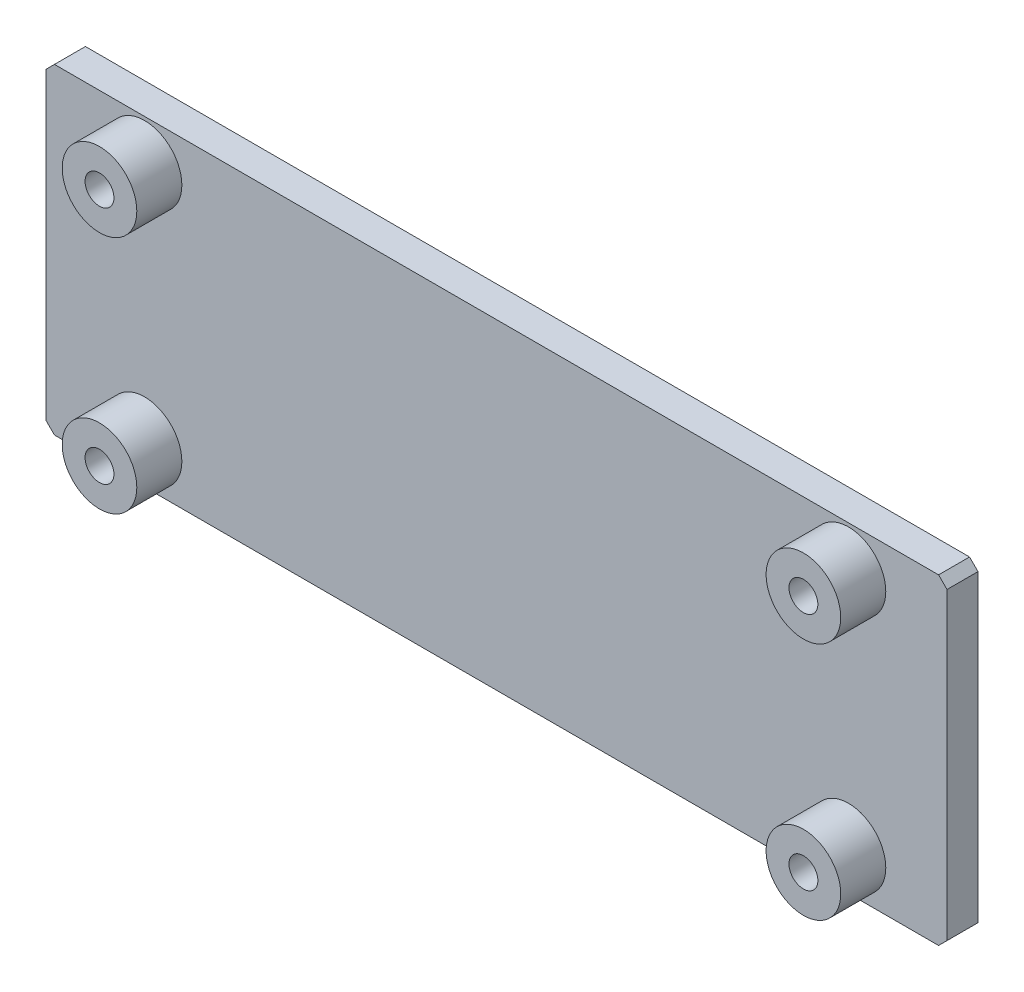
ISO-10303-21;
HEADER;
FILE_DESCRIPTION(('STEP AP214'),'2;1');
FILE_NAME('part.step','',(''),(''),'','','');
FILE_SCHEMA(('AUTOMOTIVE_DESIGN { 1 0 10303 214 1 1 1 1 }'));
ENDSEC;
DATA;
#1=APPLICATION_CONTEXT('core data for automotive mechanical design processes');
#2=APPLICATION_PROTOCOL_DEFINITION('international standard','automotive_design',2000,#1);
#3=PRODUCT_CONTEXT('',#1,'mechanical');
#4=PRODUCT('Part','Part','',(#3));
#5=PRODUCT_RELATED_PRODUCT_CATEGORY('part','',(#4));
#6=PRODUCT_DEFINITION_FORMATION('','',#4);
#7=PRODUCT_DEFINITION_CONTEXT('part definition',#1,'design');
#8=PRODUCT_DEFINITION('design','',#6,#7);
#9=PRODUCT_DEFINITION_SHAPE('','',#8);
#10=(LENGTH_UNIT() NAMED_UNIT(*) SI_UNIT(.MILLI.,.METRE.));
#11=(NAMED_UNIT(*) PLANE_ANGLE_UNIT() SI_UNIT($,.RADIAN.));
#12=(NAMED_UNIT(*) SI_UNIT($,.STERADIAN.) SOLID_ANGLE_UNIT());
#13=UNCERTAINTY_MEASURE_WITH_UNIT(LENGTH_MEASURE(1.E-05),#10,'distance_accuracy_value','');
#14=(GEOMETRIC_REPRESENTATION_CONTEXT(3) GLOBAL_UNCERTAINTY_ASSIGNED_CONTEXT((#13)) GLOBAL_UNIT_ASSIGNED_CONTEXT((#10,
#11,#12)) REPRESENTATION_CONTEXT('',''));
#15=CARTESIAN_POINT('',(0.,0.,0.));
#16=DIRECTION('',(0.,0.,1.));
#17=DIRECTION('',(1.,0.,0.));
#18=AXIS2_PLACEMENT_3D('',#15,#16,#17);
#19=CARTESIAN_POINT('',(0.,0.,2.2));
#20=DIRECTION('',(0.,0.,1.));
#21=DIRECTION('',(1.,0.,0.));
#22=AXIS2_PLACEMENT_3D('',#19,#20,#21);
#23=PLANE('',#22);
#24=CARTESIAN_POINT('',(25.,-8.5,2.2));
#25=DIRECTION('',(0.,0.,1.));
#26=DIRECTION('',(1.,0.,0.));
#27=AXIS2_PLACEMENT_3D('',#24,#25,#26);
#28=CIRCLE('',#27,2.65);
#29=CARTESIAN_POINT('',(27.65,-8.5,2.2));
#30=VERTEX_POINT('',#29);
#31=EDGE_CURVE('E293',#30,#30,#28,.T.);
#32=ORIENTED_EDGE('',*,*,#31,.F.);
#33=EDGE_LOOP('',(#32));
#34=FACE_BOUND('',#33,.T.);
#35=CARTESIAN_POINT('',(-25.,-8.5,2.2));
#36=DIRECTION('',(0.,0.,1.));
#37=DIRECTION('',(1.,0.,0.));
#38=AXIS2_PLACEMENT_3D('',#35,#36,#37);
#39=CIRCLE('',#38,2.65);
#40=CARTESIAN_POINT('',(-22.35,-8.5,2.2));
#41=VERTEX_POINT('',#40);
#42=EDGE_CURVE('E273',#41,#41,#39,.T.);
#43=ORIENTED_EDGE('',*,*,#42,.F.);
#44=EDGE_LOOP('',(#43));
#45=FACE_BOUND('',#44,.T.);
#46=DIRECTION('',(0.70710678118655,-0.707106781186546,0.));
#47=VECTOR('',#46,1.);
#48=CARTESIAN_POINT('',(-32.,-10.8,2.2));
#49=LINE('',#48,#47);
#50=CARTESIAN_POINT('',(-32.,-10.8,2.2));
#51=VERTEX_POINT('',#50);
#52=CARTESIAN_POINT('',(-31.4,-11.4,2.2));
#53=VERTEX_POINT('',#52);
#54=EDGE_CURVE('E111',#51,#53,#49,.T.);
#55=ORIENTED_EDGE('',*,*,#54,.T.);
#56=DIRECTION('',(1.,0.,0.));
#57=VECTOR('',#56,1.);
#58=CARTESIAN_POINT('',(-31.4,-11.4,2.2));
#59=LINE('',#58,#57);
#60=CARTESIAN_POINT('',(31.4,-11.4,2.2));
#61=VERTEX_POINT('',#60);
#62=EDGE_CURVE('E116',#53,#61,#59,.T.);
#63=ORIENTED_EDGE('',*,*,#62,.T.);
#64=DIRECTION('',(0.70710678118655,0.707106781186546,0.));
#65=VECTOR('',#64,1.);
#66=CARTESIAN_POINT('',(31.4,-11.4,2.2));
#67=LINE('',#66,#65);
#68=CARTESIAN_POINT('',(32.,-10.8,2.2));
#69=VERTEX_POINT('',#68);
#70=EDGE_CURVE('E122',#61,#69,#67,.T.);
#71=ORIENTED_EDGE('',*,*,#70,.T.);
#72=DIRECTION('',(0.,1.,0.));
#73=VECTOR('',#72,1.);
#74=CARTESIAN_POINT('',(32.,-10.8,2.2));
#75=LINE('',#74,#73);
#76=CARTESIAN_POINT('',(32.,10.8,2.2));
#77=VERTEX_POINT('',#76);
#78=EDGE_CURVE('E137',#69,#77,#75,.T.);
#79=ORIENTED_EDGE('',*,*,#78,.T.);
#80=DIRECTION('',(-0.70710678118655,0.707106781186546,0.));
#81=VECTOR('',#80,1.);
#82=CARTESIAN_POINT('',(32.,10.8,2.2));
#83=LINE('',#82,#81);
#84=CARTESIAN_POINT('',(31.4,11.4,2.2));
#85=VERTEX_POINT('',#84);
#86=EDGE_CURVE('E140',#77,#85,#83,.T.);
#87=ORIENTED_EDGE('',*,*,#86,.T.);
#88=DIRECTION('',(-1.,0.,0.));
#89=VECTOR('',#88,1.);
#90=CARTESIAN_POINT('',(31.4,11.4,2.2));
#91=LINE('',#90,#89);
#92=CARTESIAN_POINT('',(-31.4,11.4,2.2));
#93=VERTEX_POINT('',#92);
#94=EDGE_CURVE('E143',#85,#93,#91,.T.);
#95=ORIENTED_EDGE('',*,*,#94,.T.);
#96=DIRECTION('',(-0.70710678118655,-0.707106781186546,0.));
#97=VECTOR('',#96,1.);
#98=CARTESIAN_POINT('',(-31.4,11.4,2.2));
#99=LINE('',#98,#97);
#100=CARTESIAN_POINT('',(-32.,10.8,2.2));
#101=VERTEX_POINT('',#100);
#102=EDGE_CURVE('E146',#93,#101,#99,.T.);
#103=ORIENTED_EDGE('',*,*,#102,.T.);
#104=DIRECTION('',(0.,-1.,0.));
#105=VECTOR('',#104,1.);
#106=CARTESIAN_POINT('',(-32.,10.8,2.2));
#107=LINE('',#106,#105);
#108=EDGE_CURVE('E128',#101,#51,#107,.T.);
#109=ORIENTED_EDGE('',*,*,#108,.T.);
#110=EDGE_LOOP('',(#55,#63,#71,#79,#87,#95,#103,#109));
#111=FACE_BOUND('',#110,.T.);
#112=CARTESIAN_POINT('',(-25.,8.5,2.2));
#113=DIRECTION('',(0.,0.,1.));
#114=DIRECTION('',(1.,0.,0.));
#115=AXIS2_PLACEMENT_3D('',#112,#113,#114);
#116=CIRCLE('',#115,2.65);
#117=CARTESIAN_POINT('',(-22.35,8.5,2.2));
#118=VERTEX_POINT('',#117);
#119=EDGE_CURVE('E284',#118,#118,#116,.T.);
#120=ORIENTED_EDGE('',*,*,#119,.F.);
#121=EDGE_LOOP('',(#120));
#122=FACE_BOUND('',#121,.T.);
#123=CARTESIAN_POINT('',(25.,8.5,2.2));
#124=DIRECTION('',(0.,0.,1.));
#125=DIRECTION('',(1.,0.,0.));
#126=AXIS2_PLACEMENT_3D('',#123,#124,#125);
#127=CIRCLE('',#126,2.65);
#128=CARTESIAN_POINT('',(27.65,8.5,2.2));
#129=VERTEX_POINT('',#128);
#130=EDGE_CURVE('E302',#129,#129,#127,.T.);
#131=ORIENTED_EDGE('',*,*,#130,.F.);
#132=EDGE_LOOP('',(#131));
#133=FACE_BOUND('',#132,.T.);
#134=ADVANCED_FACE('F43',(#34,#45,#111,#122,#133),#23,.T.);
#135=CARTESIAN_POINT('',(-32.,-10.8,1.));
#136=DIRECTION('',(0.707106781186546,0.70710678118655,0.));
#137=DIRECTION('',(-0.70710678118655,0.707106781186546,0.));
#138=AXIS2_PLACEMENT_3D('',#135,#136,#137);
#139=PLANE('',#138);
#140=DIRECTION('',(0.70710678118655,-0.707106781186546,0.));
#141=VECTOR('',#140,1.);
#142=CARTESIAN_POINT('',(-32.,-10.8,0.));
#143=LINE('',#142,#141);
#144=CARTESIAN_POINT('',(-32.,-10.8,0.));
#145=VERTEX_POINT('',#144);
#146=CARTESIAN_POINT('',(-31.4,-11.4,0.));
#147=VERTEX_POINT('',#146);
#148=EDGE_CURVE('E113',#145,#147,#143,.T.);
#149=ORIENTED_EDGE('',*,*,#148,.T.);
#150=DIRECTION('',(0.,0.,-1.));
#151=VECTOR('',#150,1.);
#152=CARTESIAN_POINT('',(-31.4,-11.4,1.));
#153=LINE('',#152,#151);
#154=EDGE_CURVE('E11',#53,#147,#153,.T.);
#155=ORIENTED_EDGE('',*,*,#154,.F.);
#156=ORIENTED_EDGE('',*,*,#54,.F.);
#157=DIRECTION('',(0.,0.,-1.));
#158=VECTOR('',#157,1.);
#159=CARTESIAN_POINT('',(-32.,-10.8,1.));
#160=LINE('',#159,#158);
#161=EDGE_CURVE('E162',#51,#145,#160,.T.);
#162=ORIENTED_EDGE('',*,*,#161,.T.);
#163=EDGE_LOOP('',(#149,#155,#156,#162));
#164=FACE_BOUND('',#163,.T.);
#165=ADVANCED_FACE('F45',(#164),#139,.F.);
#166=CARTESIAN_POINT('',(-31.4,-11.4,1.));
#167=DIRECTION('',(0.,1.,0.));
#168=DIRECTION('',(0.,0.,1.));
#169=AXIS2_PLACEMENT_3D('',#166,#167,#168);
#170=PLANE('',#169);
#171=DIRECTION('',(1.,0.,0.));
#172=VECTOR('',#171,1.);
#173=CARTESIAN_POINT('',(-31.4,-11.4,0.));
#174=LINE('',#173,#172);
#175=CARTESIAN_POINT('',(31.4,-11.4,0.));
#176=VERTEX_POINT('',#175);
#177=EDGE_CURVE('E150',#147,#176,#174,.T.);
#178=ORIENTED_EDGE('',*,*,#177,.T.);
#179=DIRECTION('',(0.,0.,-1.));
#180=VECTOR('',#179,1.);
#181=CARTESIAN_POINT('',(31.4,-11.4,1.));
#182=LINE('',#181,#180);
#183=EDGE_CURVE('E51',#61,#176,#182,.T.);
#184=ORIENTED_EDGE('',*,*,#183,.F.);
#185=ORIENTED_EDGE('',*,*,#62,.F.);
#186=ORIENTED_EDGE('',*,*,#154,.T.);
#187=EDGE_LOOP('',(#178,#184,#185,#186));
#188=FACE_BOUND('',#187,.T.);
#189=ADVANCED_FACE('F117',(#188),#170,.F.);
#190=CARTESIAN_POINT('',(31.4,-11.4,1.));
#191=DIRECTION('',(-0.707106781186546,0.70710678118655,0.));
#192=DIRECTION('',(-0.70710678118655,-0.707106781186546,0.));
#193=AXIS2_PLACEMENT_3D('',#190,#191,#192);
#194=PLANE('',#193);
#195=DIRECTION('',(0.70710678118655,0.707106781186546,0.));
#196=VECTOR('',#195,1.);
#197=CARTESIAN_POINT('',(31.4,-11.4,0.));
#198=LINE('',#197,#196);
#199=CARTESIAN_POINT('',(32.,-10.8,0.));
#200=VERTEX_POINT('',#199);
#201=EDGE_CURVE('E152',#176,#200,#198,.T.);
#202=ORIENTED_EDGE('',*,*,#201,.T.);
#203=DIRECTION('',(0.,0.,-1.));
#204=VECTOR('',#203,1.);
#205=CARTESIAN_POINT('',(32.,-10.8,1.));
#206=LINE('',#205,#204);
#207=EDGE_CURVE('E174',#69,#200,#206,.T.);
#208=ORIENTED_EDGE('',*,*,#207,.F.);
#209=ORIENTED_EDGE('',*,*,#70,.F.);
#210=ORIENTED_EDGE('',*,*,#183,.T.);
#211=EDGE_LOOP('',(#202,#208,#209,#210));
#212=FACE_BOUND('',#211,.T.);
#213=ADVANCED_FACE('F178',(#212),#194,.F.);
#214=CARTESIAN_POINT('',(32.,-10.8,1.));
#215=DIRECTION('',(-1.,0.,0.));
#216=DIRECTION('',(0.,0.,1.));
#217=AXIS2_PLACEMENT_3D('',#214,#215,#216);
#218=PLANE('',#217);
#219=DIRECTION('',(0.,1.,0.));
#220=VECTOR('',#219,1.);
#221=CARTESIAN_POINT('',(32.,-10.8,0.));
#222=LINE('',#221,#220);
#223=CARTESIAN_POINT('',(32.,10.8,0.));
#224=VERTEX_POINT('',#223);
#225=EDGE_CURVE('E154',#200,#224,#222,.T.);
#226=ORIENTED_EDGE('',*,*,#225,.T.);
#227=DIRECTION('',(0.,0.,-1.));
#228=VECTOR('',#227,1.);
#229=CARTESIAN_POINT('',(32.,10.8,1.));
#230=LINE('',#229,#228);
#231=EDGE_CURVE('E171',#77,#224,#230,.T.);
#232=ORIENTED_EDGE('',*,*,#231,.F.);
#233=ORIENTED_EDGE('',*,*,#78,.F.);
#234=ORIENTED_EDGE('',*,*,#207,.T.);
#235=EDGE_LOOP('',(#226,#232,#233,#234));
#236=FACE_BOUND('',#235,.T.);
#237=ADVANCED_FACE('F185',(#236),#218,.F.);
#238=CARTESIAN_POINT('',(32.,10.8,1.));
#239=DIRECTION('',(-0.707106781186546,-0.70710678118655,0.));
#240=DIRECTION('',(0.70710678118655,-0.707106781186546,0.));
#241=AXIS2_PLACEMENT_3D('',#238,#239,#240);
#242=PLANE('',#241);
#243=DIRECTION('',(-0.70710678118655,0.707106781186546,0.));
#244=VECTOR('',#243,1.);
#245=CARTESIAN_POINT('',(32.,10.8,0.));
#246=LINE('',#245,#244);
#247=CARTESIAN_POINT('',(31.4,11.4,0.));
#248=VERTEX_POINT('',#247);
#249=EDGE_CURVE('E156',#224,#248,#246,.T.);
#250=ORIENTED_EDGE('',*,*,#249,.T.);
#251=DIRECTION('',(0.,0.,-1.));
#252=VECTOR('',#251,1.);
#253=CARTESIAN_POINT('',(31.4,11.4,1.));
#254=LINE('',#253,#252);
#255=EDGE_CURVE('E168',#85,#248,#254,.T.);
#256=ORIENTED_EDGE('',*,*,#255,.F.);
#257=ORIENTED_EDGE('',*,*,#86,.F.);
#258=ORIENTED_EDGE('',*,*,#231,.T.);
#259=EDGE_LOOP('',(#250,#256,#257,#258));
#260=FACE_BOUND('',#259,.T.);
#261=ADVANCED_FACE('F189',(#260),#242,.F.);
#262=CARTESIAN_POINT('',(31.4,11.4,1.));
#263=DIRECTION('',(0.,-1.,0.));
#264=DIRECTION('',(0.,0.,-1.));
#265=AXIS2_PLACEMENT_3D('',#262,#263,#264);
#266=PLANE('',#265);
#267=DIRECTION('',(-1.,0.,0.));
#268=VECTOR('',#267,1.);
#269=CARTESIAN_POINT('',(31.4,11.4,0.));
#270=LINE('',#269,#268);
#271=CARTESIAN_POINT('',(-31.4,11.4,0.));
#272=VERTEX_POINT('',#271);
#273=EDGE_CURVE('E158',#248,#272,#270,.T.);
#274=ORIENTED_EDGE('',*,*,#273,.T.);
#275=DIRECTION('',(0.,0.,-1.));
#276=VECTOR('',#275,1.);
#277=CARTESIAN_POINT('',(-31.4,11.4,1.));
#278=LINE('',#277,#276);
#279=EDGE_CURVE('E166',#93,#272,#278,.T.);
#280=ORIENTED_EDGE('',*,*,#279,.F.);
#281=ORIENTED_EDGE('',*,*,#94,.F.);
#282=ORIENTED_EDGE('',*,*,#255,.T.);
#283=EDGE_LOOP('',(#274,#280,#281,#282));
#284=FACE_BOUND('',#283,.T.);
#285=ADVANCED_FACE('F193',(#284),#266,.F.);
#286=CARTESIAN_POINT('',(-31.4,11.4,1.));
#287=DIRECTION('',(0.707106781186546,-0.70710678118655,0.));
#288=DIRECTION('',(0.70710678118655,0.707106781186546,0.));
#289=AXIS2_PLACEMENT_3D('',#286,#287,#288);
#290=PLANE('',#289);
#291=DIRECTION('',(-0.70710678118655,-0.707106781186546,0.));
#292=VECTOR('',#291,1.);
#293=CARTESIAN_POINT('',(-31.4,11.4,0.));
#294=LINE('',#293,#292);
#295=CARTESIAN_POINT('',(-32.,10.8,0.));
#296=VERTEX_POINT('',#295);
#297=EDGE_CURVE('E66',#272,#296,#294,.T.);
#298=ORIENTED_EDGE('',*,*,#297,.T.);
#299=DIRECTION('',(0.,0.,-1.));
#300=VECTOR('',#299,1.);
#301=CARTESIAN_POINT('',(-32.,10.8,1.));
#302=LINE('',#301,#300);
#303=EDGE_CURVE('E164',#101,#296,#302,.T.);
#304=ORIENTED_EDGE('',*,*,#303,.F.);
#305=ORIENTED_EDGE('',*,*,#102,.F.);
#306=ORIENTED_EDGE('',*,*,#279,.T.);
#307=EDGE_LOOP('',(#298,#304,#305,#306));
#308=FACE_BOUND('',#307,.T.);
#309=ADVANCED_FACE('F194',(#308),#290,.F.);
#310=CARTESIAN_POINT('',(-32.,10.8,1.));
#311=DIRECTION('',(1.,0.,0.));
#312=DIRECTION('',(0.,0.,-1.));
#313=AXIS2_PLACEMENT_3D('',#310,#311,#312);
#314=PLANE('',#313);
#315=DIRECTION('',(0.,-1.,0.));
#316=VECTOR('',#315,1.);
#317=CARTESIAN_POINT('',(-32.,10.8,0.));
#318=LINE('',#317,#316);
#319=EDGE_CURVE('E58',#296,#145,#318,.T.);
#320=ORIENTED_EDGE('',*,*,#319,.T.);
#321=ORIENTED_EDGE('',*,*,#161,.F.);
#322=ORIENTED_EDGE('',*,*,#108,.F.);
#323=ORIENTED_EDGE('',*,*,#303,.T.);
#324=EDGE_LOOP('',(#320,#321,#322,#323));
#325=FACE_BOUND('',#324,.T.);
#326=ADVANCED_FACE('F195',(#325),#314,.F.);
#327=CARTESIAN_POINT('',(0.,0.,0.));
#328=DIRECTION('',(0.,0.,1.));
#329=DIRECTION('',(1.,0.,0.));
#330=AXIS2_PLACEMENT_3D('',#327,#328,#329);
#331=PLANE('',#330);
#332=ORIENTED_EDGE('',*,*,#148,.F.);
#333=ORIENTED_EDGE('',*,*,#319,.F.);
#334=ORIENTED_EDGE('',*,*,#297,.F.);
#335=ORIENTED_EDGE('',*,*,#273,.F.);
#336=ORIENTED_EDGE('',*,*,#249,.F.);
#337=ORIENTED_EDGE('',*,*,#225,.F.);
#338=ORIENTED_EDGE('',*,*,#201,.F.);
#339=ORIENTED_EDGE('',*,*,#177,.F.);
#340=EDGE_LOOP('',(#332,#333,#334,#335,#336,#337,#338,#339));
#341=FACE_BOUND('',#340,.T.);
#342=ADVANCED_FACE('F181',(#341),#331,.F.);
#343=CARTESIAN_POINT('',(-25.,-8.5,5.4));
#344=DIRECTION('',(0.,0.,1.));
#345=DIRECTION('',(1.,0.,0.));
#346=AXIS2_PLACEMENT_3D('',#343,#344,#345);
#347=PLANE('',#346);
#348=CARTESIAN_POINT('',(-25.,-8.5,5.4));
#349=DIRECTION('',(0.,0.,1.));
#350=DIRECTION('',(1.,0.,0.));
#351=AXIS2_PLACEMENT_3D('',#348,#349,#350);
#352=CIRCLE('',#351,2.65);
#353=CARTESIAN_POINT('',(-22.35,-8.5,5.4));
#354=VERTEX_POINT('',#353);
#355=EDGE_CURVE('E270',#354,#354,#352,.T.);
#356=ORIENTED_EDGE('',*,*,#355,.T.);
#357=EDGE_LOOP('',(#356));
#358=FACE_BOUND('',#357,.T.);
#359=CARTESIAN_POINT('',(-25.,-8.5,5.4));
#360=DIRECTION('',(0.,0.,1.));
#361=DIRECTION('',(1.,0.,0.));
#362=AXIS2_PLACEMENT_3D('',#359,#360,#361);
#363=CIRCLE('',#362,1.025);
#364=CARTESIAN_POINT('',(-23.975,-8.5,5.4));
#365=VERTEX_POINT('',#364);
#366=EDGE_CURVE('E276',#365,#365,#363,.T.);
#367=ORIENTED_EDGE('',*,*,#366,.F.);
#368=EDGE_LOOP('',(#367));
#369=FACE_BOUND('',#368,.T.);
#370=ADVANCED_FACE('F203',(#358,#369),#347,.T.);
#371=CARTESIAN_POINT('',(-25.,-8.5,5.4));
#372=DIRECTION('',(0.,0.,-1.));
#373=DIRECTION('',(-1.,0.,0.));
#374=AXIS2_PLACEMENT_3D('',#371,#372,#373);
#375=CYLINDRICAL_SURFACE('',#374,2.65);
#376=ORIENTED_EDGE('',*,*,#355,.F.);
#377=EDGE_LOOP('',(#376));
#378=FACE_BOUND('',#377,.T.);
#379=ORIENTED_EDGE('',*,*,#42,.T.);
#380=EDGE_LOOP('',(#379));
#381=FACE_BOUND('',#380,.T.);
#382=ADVANCED_FACE('F222',(#378,#381),#375,.T.);
#383=CARTESIAN_POINT('',(0.,0.,1.));
#384=DIRECTION('',(0.,0.,1.));
#385=DIRECTION('',(1.,0.,0.));
#386=AXIS2_PLACEMENT_3D('',#383,#384,#385);
#387=PLANE('',#386);
#388=CARTESIAN_POINT('',(-25.,-8.5,1.));
#389=DIRECTION('',(0.,0.,1.));
#390=DIRECTION('',(1.,0.,0.));
#391=AXIS2_PLACEMENT_3D('',#388,#389,#390);
#392=CIRCLE('',#391,1.025);
#393=CARTESIAN_POINT('',(-23.975,-8.5,1.));
#394=VERTEX_POINT('',#393);
#395=EDGE_CURVE('E129',#394,#394,#392,.T.);
#396=ORIENTED_EDGE('',*,*,#395,.T.);
#397=EDGE_LOOP('',(#396));
#398=FACE_BOUND('',#397,.T.);
#399=ADVANCED_FACE('F220',(#398),#387,.T.);
#400=CARTESIAN_POINT('',(-25.,-8.5,2.2));
#401=DIRECTION('',(0.,0.,-1.));
#402=DIRECTION('',(-1.,0.,0.));
#403=AXIS2_PLACEMENT_3D('',#400,#401,#402);
#404=CYLINDRICAL_SURFACE('',#403,1.025);
#405=ORIENTED_EDGE('',*,*,#395,.F.);
#406=EDGE_LOOP('',(#405));
#407=FACE_BOUND('',#406,.T.);
#408=ORIENTED_EDGE('',*,*,#366,.T.);
#409=EDGE_LOOP('',(#408));
#410=FACE_BOUND('',#409,.T.);
#411=ADVANCED_FACE('F218',(#407,#410),#404,.F.);
#412=CARTESIAN_POINT('',(-25.,8.5,5.4));
#413=DIRECTION('',(0.,0.,1.));
#414=DIRECTION('',(1.,0.,0.));
#415=AXIS2_PLACEMENT_3D('',#412,#413,#414);
#416=PLANE('',#415);
#417=CARTESIAN_POINT('',(-25.,8.5,5.4));
#418=DIRECTION('',(0.,0.,1.));
#419=DIRECTION('',(1.,0.,0.));
#420=AXIS2_PLACEMENT_3D('',#417,#418,#419);
#421=CIRCLE('',#420,2.65);
#422=CARTESIAN_POINT('',(-22.35,8.5,5.4));
#423=VERTEX_POINT('',#422);
#424=EDGE_CURVE('E285',#423,#423,#421,.T.);
#425=ORIENTED_EDGE('',*,*,#424,.T.);
#426=EDGE_LOOP('',(#425));
#427=FACE_BOUND('',#426,.T.);
#428=CARTESIAN_POINT('',(-25.,8.5,5.4));
#429=DIRECTION('',(0.,0.,1.));
#430=DIRECTION('',(1.,0.,0.));
#431=AXIS2_PLACEMENT_3D('',#428,#429,#430);
#432=CIRCLE('',#431,1.025);
#433=CARTESIAN_POINT('',(-23.975,8.5,5.4));
#434=VERTEX_POINT('',#433);
#435=EDGE_CURVE('E281',#434,#434,#432,.T.);
#436=ORIENTED_EDGE('',*,*,#435,.F.);
#437=EDGE_LOOP('',(#436));
#438=FACE_BOUND('',#437,.T.);
#439=ADVANCED_FACE('F230',(#427,#438),#416,.T.);
#440=CARTESIAN_POINT('',(-25.,8.5,5.4));
#441=DIRECTION('',(0.,0.,-1.));
#442=DIRECTION('',(-1.,0.,0.));
#443=AXIS2_PLACEMENT_3D('',#440,#441,#442);
#444=CYLINDRICAL_SURFACE('',#443,2.65);
#445=ORIENTED_EDGE('',*,*,#424,.F.);
#446=EDGE_LOOP('',(#445));
#447=FACE_BOUND('',#446,.T.);
#448=ORIENTED_EDGE('',*,*,#119,.T.);
#449=EDGE_LOOP('',(#448));
#450=FACE_BOUND('',#449,.T.);
#451=ADVANCED_FACE('F236',(#447,#450),#444,.T.);
#452=CARTESIAN_POINT('',(-25.,8.5,1.));
#453=DIRECTION('',(0.,0.,1.));
#454=DIRECTION('',(1.,0.,0.));
#455=AXIS2_PLACEMENT_3D('',#452,#453,#454);
#456=CIRCLE('',#455,1.025);
#457=CARTESIAN_POINT('',(-23.975,8.5,1.));
#458=VERTEX_POINT('',#457);
#459=EDGE_CURVE('E132',#458,#458,#456,.T.);
#460=ORIENTED_EDGE('',*,*,#459,.T.);
#461=EDGE_LOOP('',(#460));
#462=FACE_BOUND('',#461,.T.);
#463=ADVANCED_FACE('F224',(#462),#387,.T.);
#464=CARTESIAN_POINT('',(-25.,8.5,2.2));
#465=DIRECTION('',(0.,0.,-1.));
#466=DIRECTION('',(-1.,0.,0.));
#467=AXIS2_PLACEMENT_3D('',#464,#465,#466);
#468=CYLINDRICAL_SURFACE('',#467,1.025);
#469=ORIENTED_EDGE('',*,*,#459,.F.);
#470=EDGE_LOOP('',(#469));
#471=FACE_BOUND('',#470,.T.);
#472=ORIENTED_EDGE('',*,*,#435,.T.);
#473=EDGE_LOOP('',(#472));
#474=FACE_BOUND('',#473,.T.);
#475=ADVANCED_FACE('F235',(#471,#474),#468,.F.);
#476=CARTESIAN_POINT('',(25.,-8.5,5.4));
#477=DIRECTION('',(0.,0.,1.));
#478=DIRECTION('',(1.,0.,0.));
#479=AXIS2_PLACEMENT_3D('',#476,#477,#478);
#480=PLANE('',#479);
#481=CARTESIAN_POINT('',(25.,-8.5,5.4));
#482=DIRECTION('',(0.,0.,1.));
#483=DIRECTION('',(1.,0.,0.));
#484=AXIS2_PLACEMENT_3D('',#481,#482,#483);
#485=CIRCLE('',#484,2.65);
#486=CARTESIAN_POINT('',(27.65,-8.5,5.4));
#487=VERTEX_POINT('',#486);
#488=EDGE_CURVE('E294',#487,#487,#485,.T.);
#489=ORIENTED_EDGE('',*,*,#488,.T.);
#490=EDGE_LOOP('',(#489));
#491=FACE_BOUND('',#490,.T.);
#492=CARTESIAN_POINT('',(25.,-8.5,5.4));
#493=DIRECTION('',(0.,0.,1.));
#494=DIRECTION('',(1.,0.,0.));
#495=AXIS2_PLACEMENT_3D('',#492,#493,#494);
#496=CIRCLE('',#495,1.025);
#497=CARTESIAN_POINT('',(26.025,-8.5,5.4));
#498=VERTEX_POINT('',#497);
#499=EDGE_CURVE('E288',#498,#498,#496,.T.);
#500=ORIENTED_EDGE('',*,*,#499,.F.);
#501=EDGE_LOOP('',(#500));
#502=FACE_BOUND('',#501,.T.);
#503=ADVANCED_FACE('F261',(#491,#502),#480,.T.);
#504=CARTESIAN_POINT('',(25.,-8.5,5.4));
#505=DIRECTION('',(0.,0.,-1.));
#506=DIRECTION('',(-1.,0.,0.));
#507=AXIS2_PLACEMENT_3D('',#504,#505,#506);
#508=CYLINDRICAL_SURFACE('',#507,2.65);
#509=ORIENTED_EDGE('',*,*,#488,.F.);
#510=EDGE_LOOP('',(#509));
#511=FACE_BOUND('',#510,.T.);
#512=ORIENTED_EDGE('',*,*,#31,.T.);
#513=EDGE_LOOP('',(#512));
#514=FACE_BOUND('',#513,.T.);
#515=ADVANCED_FACE('F253',(#511,#514),#508,.T.);
#516=CARTESIAN_POINT('',(25.,-8.5,1.));
#517=DIRECTION('',(0.,0.,1.));
#518=DIRECTION('',(1.,0.,0.));
#519=AXIS2_PLACEMENT_3D('',#516,#517,#518);
#520=CIRCLE('',#519,1.025);
#521=CARTESIAN_POINT('',(26.025,-8.5,1.));
#522=VERTEX_POINT('',#521);
#523=EDGE_CURVE('E266',#522,#522,#520,.T.);
#524=ORIENTED_EDGE('',*,*,#523,.T.);
#525=EDGE_LOOP('',(#524));
#526=FACE_BOUND('',#525,.T.);
#527=ADVANCED_FACE('F238',(#526),#387,.T.);
#528=CARTESIAN_POINT('',(25.,-8.5,2.2));
#529=DIRECTION('',(0.,0.,-1.));
#530=DIRECTION('',(-1.,0.,0.));
#531=AXIS2_PLACEMENT_3D('',#528,#529,#530);
#532=CYLINDRICAL_SURFACE('',#531,1.025);
#533=ORIENTED_EDGE('',*,*,#523,.F.);
#534=EDGE_LOOP('',(#533));
#535=FACE_BOUND('',#534,.T.);
#536=ORIENTED_EDGE('',*,*,#499,.T.);
#537=EDGE_LOOP('',(#536));
#538=FACE_BOUND('',#537,.T.);
#539=ADVANCED_FACE('F252',(#535,#538),#532,.F.);
#540=CARTESIAN_POINT('',(25.,8.5,5.4));
#541=DIRECTION('',(0.,0.,1.));
#542=DIRECTION('',(1.,0.,0.));
#543=AXIS2_PLACEMENT_3D('',#540,#541,#542);
#544=PLANE('',#543);
#545=CARTESIAN_POINT('',(25.,8.5,5.4));
#546=DIRECTION('',(0.,0.,1.));
#547=DIRECTION('',(1.,0.,0.));
#548=AXIS2_PLACEMENT_3D('',#545,#546,#547);
#549=CIRCLE('',#548,2.65);
#550=CARTESIAN_POINT('',(27.65,8.5,5.4));
#551=VERTEX_POINT('',#550);
#552=EDGE_CURVE('E303',#551,#551,#549,.T.);
#553=ORIENTED_EDGE('',*,*,#552,.T.);
#554=EDGE_LOOP('',(#553));
#555=FACE_BOUND('',#554,.T.);
#556=CARTESIAN_POINT('',(25.,8.5,5.4));
#557=DIRECTION('',(0.,0.,1.));
#558=DIRECTION('',(1.,0.,0.));
#559=AXIS2_PLACEMENT_3D('',#556,#557,#558);
#560=CIRCLE('',#559,1.025);
#561=CARTESIAN_POINT('',(26.025,8.5,5.4));
#562=VERTEX_POINT('',#561);
#563=EDGE_CURVE('E297',#562,#562,#560,.T.);
#564=ORIENTED_EDGE('',*,*,#563,.F.);
#565=EDGE_LOOP('',(#564));
#566=FACE_BOUND('',#565,.T.);
#567=ADVANCED_FACE('F248',(#555,#566),#544,.T.);
#568=CARTESIAN_POINT('',(25.,8.5,5.4));
#569=DIRECTION('',(0.,0.,-1.));
#570=DIRECTION('',(-1.,0.,0.));
#571=AXIS2_PLACEMENT_3D('',#568,#569,#570);
#572=CYLINDRICAL_SURFACE('',#571,2.65);
#573=ORIENTED_EDGE('',*,*,#552,.F.);
#574=EDGE_LOOP('',(#573));
#575=FACE_BOUND('',#574,.T.);
#576=ORIENTED_EDGE('',*,*,#130,.T.);
#577=EDGE_LOOP('',(#576));
#578=FACE_BOUND('',#577,.T.);
#579=ADVANCED_FACE('F240',(#575,#578),#572,.T.);
#580=CARTESIAN_POINT('',(25.,8.5,1.));
#581=DIRECTION('',(0.,0.,1.));
#582=DIRECTION('',(1.,0.,0.));
#583=AXIS2_PLACEMENT_3D('',#580,#581,#582);
#584=CIRCLE('',#583,1.025);
#585=CARTESIAN_POINT('',(26.025,8.5,1.));
#586=VERTEX_POINT('',#585);
#587=EDGE_CURVE('E267',#586,#586,#584,.T.);
#588=ORIENTED_EDGE('',*,*,#587,.T.);
#589=EDGE_LOOP('',(#588));
#590=FACE_BOUND('',#589,.T.);
#591=ADVANCED_FACE('F225',(#590),#387,.T.);
#592=CARTESIAN_POINT('',(25.,8.5,2.2));
#593=DIRECTION('',(0.,0.,-1.));
#594=DIRECTION('',(-1.,0.,0.));
#595=AXIS2_PLACEMENT_3D('',#592,#593,#594);
#596=CYLINDRICAL_SURFACE('',#595,1.025);
#597=ORIENTED_EDGE('',*,*,#587,.F.);
#598=EDGE_LOOP('',(#597));
#599=FACE_BOUND('',#598,.T.);
#600=ORIENTED_EDGE('',*,*,#563,.T.);
#601=EDGE_LOOP('',(#600));
#602=FACE_BOUND('',#601,.T.);
#603=ADVANCED_FACE('F239',(#599,#602),#596,.F.);
#604=CLOSED_SHELL('',(#134,#165,#189,#213,#237,#261,#285,#309,#326,#342,#370,#382,#399,#411,
#439,#451,#463,#475,#503,#515,#527,#539,#567,#579,#591,#603));
#605=MANIFOLD_SOLID_BREP('B2',#604);
#606=ADVANCED_BREP_SHAPE_REPRESENTATION('',(#18,#605),#14);
#607=SHAPE_DEFINITION_REPRESENTATION(#9,#606);
ENDSEC;
END-ISO-10303-21;
